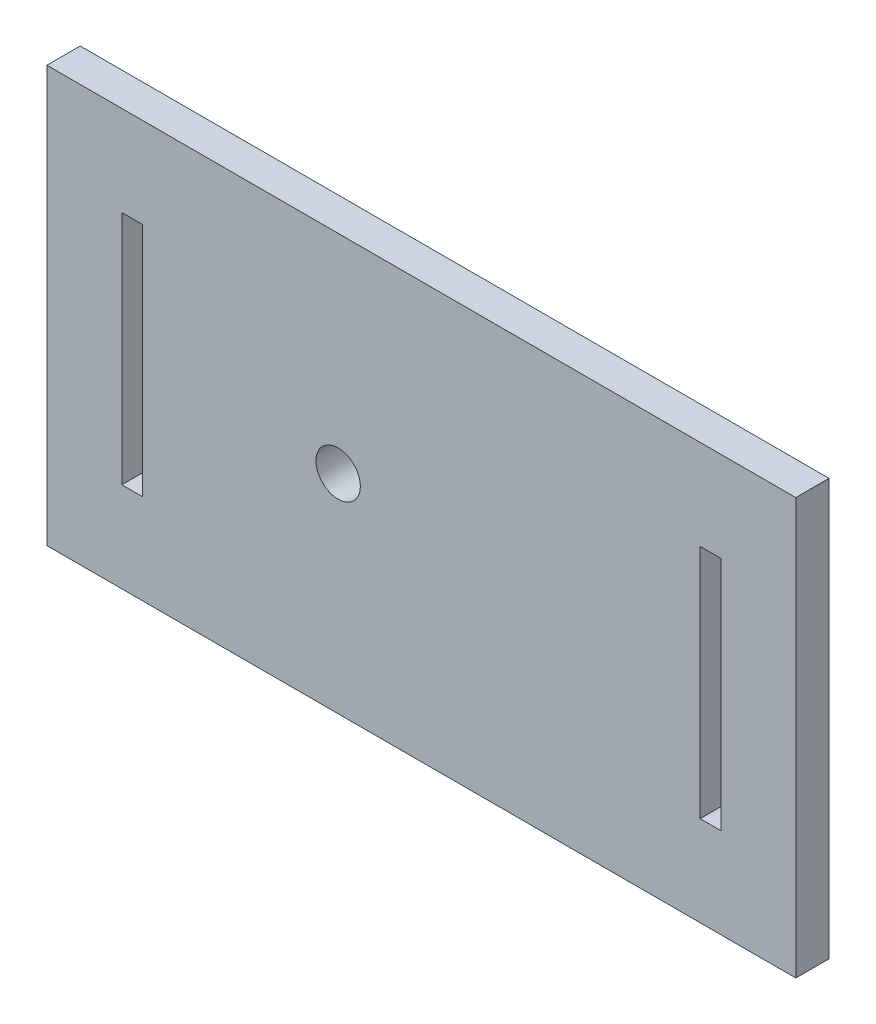
ISO-10303-21;
HEADER;
FILE_DESCRIPTION(('STEP AP214'),'2;1');
FILE_NAME('part.step','',(''),(''),'','','');
FILE_SCHEMA(('AUTOMOTIVE_DESIGN { 1 0 10303 214 1 1 1 1 }'));
ENDSEC;
DATA;
#1=APPLICATION_CONTEXT('core data for automotive mechanical design processes');
#2=APPLICATION_PROTOCOL_DEFINITION('international standard','automotive_design',2000,#1);
#3=PRODUCT_CONTEXT('',#1,'mechanical');
#4=PRODUCT('Part','Part','',(#3));
#5=PRODUCT_RELATED_PRODUCT_CATEGORY('part','',(#4));
#6=PRODUCT_DEFINITION_FORMATION('','',#4);
#7=PRODUCT_DEFINITION_CONTEXT('part definition',#1,'design');
#8=PRODUCT_DEFINITION('design','',#6,#7);
#9=PRODUCT_DEFINITION_SHAPE('','',#8);
#10=(LENGTH_UNIT() NAMED_UNIT(*) SI_UNIT(.MILLI.,.METRE.));
#11=(NAMED_UNIT(*) PLANE_ANGLE_UNIT() SI_UNIT($,.RADIAN.));
#12=(NAMED_UNIT(*) SI_UNIT($,.STERADIAN.) SOLID_ANGLE_UNIT());
#13=UNCERTAINTY_MEASURE_WITH_UNIT(LENGTH_MEASURE(1.E-05),#10,'distance_accuracy_value','');
#14=(GEOMETRIC_REPRESENTATION_CONTEXT(3) GLOBAL_UNCERTAINTY_ASSIGNED_CONTEXT((#13)) GLOBAL_UNIT_ASSIGNED_CONTEXT((#10,
#11,#12)) REPRESENTATION_CONTEXT('',''));
#15=CARTESIAN_POINT('',(0.,0.,0.));
#16=DIRECTION('',(0.,0.,1.));
#17=DIRECTION('',(1.,0.,0.));
#18=AXIS2_PLACEMENT_3D('',#15,#16,#17);
#19=CARTESIAN_POINT('',(27.,0.,2.4));
#20=DIRECTION('',(1.,0.,0.));
#21=DIRECTION('',(0.,1.,0.));
#22=AXIS2_PLACEMENT_3D('',#19,#20,#21);
#23=PLANE('',#22);
#24=DIRECTION('',(0.,-1.,0.));
#25=VECTOR('',#24,1.);
#26=CARTESIAN_POINT('',(27.,0.,0.));
#27=LINE('',#26,#25);
#28=CARTESIAN_POINT('',(27.,15.,0.));
#29=VERTEX_POINT('',#28);
#30=CARTESIAN_POINT('',(27.,-15.,0.));
#31=VERTEX_POINT('',#30);
#32=EDGE_CURVE('E208',#29,#31,#27,.T.);
#33=ORIENTED_EDGE('',*,*,#32,.F.);
#34=DIRECTION('',(0.,0.,-1.));
#35=VECTOR('',#34,1.);
#36=CARTESIAN_POINT('',(27.,15.,2.4));
#37=LINE('',#36,#35);
#38=CARTESIAN_POINT('',(27.,15.,2.4));
#39=VERTEX_POINT('',#38);
#40=EDGE_CURVE('E11',#39,#29,#37,.T.);
#41=ORIENTED_EDGE('',*,*,#40,.F.);
#42=DIRECTION('',(0.,-1.,0.));
#43=VECTOR('',#42,1.);
#44=CARTESIAN_POINT('',(27.,0.,2.4));
#45=LINE('',#44,#43);
#46=CARTESIAN_POINT('',(27.,-15.,2.4));
#47=VERTEX_POINT('',#46);
#48=EDGE_CURVE('E144',#39,#47,#45,.T.);
#49=ORIENTED_EDGE('',*,*,#48,.T.);
#50=DIRECTION('',(0.,0.,-1.));
#51=VECTOR('',#50,1.);
#52=CARTESIAN_POINT('',(27.,-15.,2.4));
#53=LINE('',#52,#51);
#54=EDGE_CURVE('E53',#47,#31,#53,.T.);
#55=ORIENTED_EDGE('',*,*,#54,.T.);
#56=EDGE_LOOP('',(#33,#41,#49,#55));
#57=FACE_BOUND('',#56,.T.);
#58=ADVANCED_FACE('F34',(#57),#23,.T.);
#59=CARTESIAN_POINT('',(0.,15.,2.4));
#60=DIRECTION('',(0.,-1.,0.));
#61=DIRECTION('',(1.,0.,0.));
#62=AXIS2_PLACEMENT_3D('',#59,#60,#61);
#63=PLANE('',#62);
#64=DIRECTION('',(-1.,0.,0.));
#65=VECTOR('',#64,1.);
#66=CARTESIAN_POINT('',(0.,15.,0.));
#67=LINE('',#66,#65);
#68=CARTESIAN_POINT('',(-27.,15.,0.));
#69=VERTEX_POINT('',#68);
#70=EDGE_CURVE('E149',#29,#69,#67,.T.);
#71=ORIENTED_EDGE('',*,*,#70,.T.);
#72=DIRECTION('',(0.,0.,-1.));
#73=VECTOR('',#72,1.);
#74=CARTESIAN_POINT('',(-27.,15.,2.4));
#75=LINE('',#74,#73);
#76=CARTESIAN_POINT('',(-27.,15.,2.4));
#77=VERTEX_POINT('',#76);
#78=EDGE_CURVE('E44',#77,#69,#75,.T.);
#79=ORIENTED_EDGE('',*,*,#78,.F.);
#80=DIRECTION('',(-1.,0.,0.));
#81=VECTOR('',#80,1.);
#82=CARTESIAN_POINT('',(0.,15.,2.4));
#83=LINE('',#82,#81);
#84=EDGE_CURVE('E138',#39,#77,#83,.T.);
#85=ORIENTED_EDGE('',*,*,#84,.F.);
#86=ORIENTED_EDGE('',*,*,#40,.T.);
#87=EDGE_LOOP('',(#71,#79,#85,#86));
#88=FACE_BOUND('',#87,.T.);
#89=ADVANCED_FACE('F147',(#88),#63,.F.);
#90=CARTESIAN_POINT('',(-27.,0.,2.4));
#91=DIRECTION('',(1.,0.,0.));
#92=DIRECTION('',(0.,1.,0.));
#93=AXIS2_PLACEMENT_3D('',#90,#91,#92);
#94=PLANE('',#93);
#95=DIRECTION('',(0.,-1.,0.));
#96=VECTOR('',#95,1.);
#97=CARTESIAN_POINT('',(-27.,0.,0.));
#98=LINE('',#97,#96);
#99=CARTESIAN_POINT('',(-27.,-15.,0.));
#100=VERTEX_POINT('',#99);
#101=EDGE_CURVE('E211',#69,#100,#98,.T.);
#102=ORIENTED_EDGE('',*,*,#101,.T.);
#103=DIRECTION('',(0.,0.,-1.));
#104=VECTOR('',#103,1.);
#105=CARTESIAN_POINT('',(-27.,-15.,2.4));
#106=LINE('',#105,#104);
#107=CARTESIAN_POINT('',(-27.,-15.,2.4));
#108=VERTEX_POINT('',#107);
#109=EDGE_CURVE('E91',#108,#100,#106,.T.);
#110=ORIENTED_EDGE('',*,*,#109,.F.);
#111=DIRECTION('',(0.,-1.,0.));
#112=VECTOR('',#111,1.);
#113=CARTESIAN_POINT('',(-27.,0.,2.4));
#114=LINE('',#113,#112);
#115=EDGE_CURVE('E130',#77,#108,#114,.T.);
#116=ORIENTED_EDGE('',*,*,#115,.F.);
#117=ORIENTED_EDGE('',*,*,#78,.T.);
#118=EDGE_LOOP('',(#102,#110,#116,#117));
#119=FACE_BOUND('',#118,.T.);
#120=ADVANCED_FACE('F132',(#119),#94,.F.);
#121=CARTESIAN_POINT('',(0.,8.50000000000002,2.4));
#122=DIRECTION('',(0.,-1.,0.));
#123=DIRECTION('',(1.,0.,0.));
#124=AXIS2_PLACEMENT_3D('',#121,#122,#123);
#125=PLANE('',#124);
#126=DIRECTION('',(-1.,0.,0.));
#127=VECTOR('',#126,1.);
#128=CARTESIAN_POINT('',(0.,8.50000000000002,0.));
#129=LINE('',#128,#127);
#130=CARTESIAN_POINT('',(-20.1,8.5,0.));
#131=VERTEX_POINT('',#130);
#132=CARTESIAN_POINT('',(-21.6,8.5,0.));
#133=VERTEX_POINT('',#132);
#134=EDGE_CURVE('E196',#131,#133,#129,.T.);
#135=ORIENTED_EDGE('',*,*,#134,.F.);
#136=DIRECTION('',(0.,0.,-1.));
#137=VECTOR('',#136,1.);
#138=CARTESIAN_POINT('',(-20.1,8.5,2.4));
#139=LINE('',#138,#137);
#140=CARTESIAN_POINT('',(-20.1,8.5,2.4));
#141=VERTEX_POINT('',#140);
#142=EDGE_CURVE('E161',#141,#131,#139,.T.);
#143=ORIENTED_EDGE('',*,*,#142,.F.);
#144=DIRECTION('',(-1.,0.,0.));
#145=VECTOR('',#144,1.);
#146=CARTESIAN_POINT('',(0.,8.50000000000002,2.4));
#147=LINE('',#146,#145);
#148=CARTESIAN_POINT('',(-21.6,8.5,2.4));
#149=VERTEX_POINT('',#148);
#150=EDGE_CURVE('E230',#141,#149,#147,.T.);
#151=ORIENTED_EDGE('',*,*,#150,.T.);
#152=DIRECTION('',(0.,0.,-1.));
#153=VECTOR('',#152,1.);
#154=CARTESIAN_POINT('',(-21.6,8.5,2.4));
#155=LINE('',#154,#153);
#156=EDGE_CURVE('E154',#149,#133,#155,.T.);
#157=ORIENTED_EDGE('',*,*,#156,.T.);
#158=EDGE_LOOP('',(#135,#143,#151,#157));
#159=FACE_BOUND('',#158,.T.);
#160=ADVANCED_FACE('F277',(#159),#125,.T.);
#161=CARTESIAN_POINT('',(-20.1,0.,2.4));
#162=DIRECTION('',(1.,0.,0.));
#163=DIRECTION('',(0.,0.,-1.));
#164=AXIS2_PLACEMENT_3D('',#161,#162,#163);
#165=PLANE('',#164);
#166=DIRECTION('',(0.,-1.,0.));
#167=VECTOR('',#166,1.);
#168=CARTESIAN_POINT('',(-20.1,0.,0.));
#169=LINE('',#168,#167);
#170=CARTESIAN_POINT('',(-20.1,-8.5,0.));
#171=VERTEX_POINT('',#170);
#172=EDGE_CURVE('E199',#131,#171,#169,.T.);
#173=ORIENTED_EDGE('',*,*,#172,.T.);
#174=DIRECTION('',(0.,0.,-1.));
#175=VECTOR('',#174,1.);
#176=CARTESIAN_POINT('',(-20.1,-8.5,2.4));
#177=LINE('',#176,#175);
#178=CARTESIAN_POINT('',(-20.1,-8.5,2.4));
#179=VERTEX_POINT('',#178);
#180=EDGE_CURVE('E158',#179,#171,#177,.T.);
#181=ORIENTED_EDGE('',*,*,#180,.F.);
#182=DIRECTION('',(0.,-1.,0.));
#183=VECTOR('',#182,1.);
#184=CARTESIAN_POINT('',(-20.1,0.,2.4));
#185=LINE('',#184,#183);
#186=EDGE_CURVE('E233',#141,#179,#185,.T.);
#187=ORIENTED_EDGE('',*,*,#186,.F.);
#188=ORIENTED_EDGE('',*,*,#142,.T.);
#189=EDGE_LOOP('',(#173,#181,#187,#188));
#190=FACE_BOUND('',#189,.T.);
#191=ADVANCED_FACE('F273',(#190),#165,.F.);
#192=CARTESIAN_POINT('',(0.,-8.5,2.4));
#193=DIRECTION('',(0.,-1.,0.));
#194=DIRECTION('',(1.,0.,0.));
#195=AXIS2_PLACEMENT_3D('',#192,#193,#194);
#196=PLANE('',#195);
#197=DIRECTION('',(-1.,0.,0.));
#198=VECTOR('',#197,1.);
#199=CARTESIAN_POINT('',(0.,-8.5,0.));
#200=LINE('',#199,#198);
#201=CARTESIAN_POINT('',(-21.6,-8.5,0.));
#202=VERTEX_POINT('',#201);
#203=EDGE_CURVE('E202',#171,#202,#200,.T.);
#204=ORIENTED_EDGE('',*,*,#203,.T.);
#205=DIRECTION('',(0.,0.,-1.));
#206=VECTOR('',#205,1.);
#207=CARTESIAN_POINT('',(-21.6,-8.5,2.4));
#208=LINE('',#207,#206);
#209=CARTESIAN_POINT('',(-21.6,-8.5,2.4));
#210=VERTEX_POINT('',#209);
#211=EDGE_CURVE('E156',#210,#202,#208,.T.);
#212=ORIENTED_EDGE('',*,*,#211,.F.);
#213=DIRECTION('',(-1.,0.,0.));
#214=VECTOR('',#213,1.);
#215=CARTESIAN_POINT('',(0.,-8.5,2.4));
#216=LINE('',#215,#214);
#217=EDGE_CURVE('E236',#179,#210,#216,.T.);
#218=ORIENTED_EDGE('',*,*,#217,.F.);
#219=ORIENTED_EDGE('',*,*,#180,.T.);
#220=EDGE_LOOP('',(#204,#212,#218,#219));
#221=FACE_BOUND('',#220,.T.);
#222=ADVANCED_FACE('F270',(#221),#196,.F.);
#223=CARTESIAN_POINT('',(20.1,0.,2.4));
#224=DIRECTION('',(1.,0.,0.));
#225=DIRECTION('',(0.,1.,0.));
#226=AXIS2_PLACEMENT_3D('',#223,#224,#225);
#227=PLANE('',#226);
#228=DIRECTION('',(0.,-1.,0.));
#229=VECTOR('',#228,1.);
#230=CARTESIAN_POINT('',(20.1,0.,0.));
#231=LINE('',#230,#229);
#232=CARTESIAN_POINT('',(20.1,8.50000000000001,0.));
#233=VERTEX_POINT('',#232);
#234=CARTESIAN_POINT('',(20.1,-8.49999999999999,0.));
#235=VERTEX_POINT('',#234);
#236=EDGE_CURVE('E185',#233,#235,#231,.T.);
#237=ORIENTED_EDGE('',*,*,#236,.F.);
#238=DIRECTION('',(0.,0.,-1.));
#239=VECTOR('',#238,1.);
#240=CARTESIAN_POINT('',(20.1,8.50000000000001,2.4));
#241=LINE('',#240,#239);
#242=CARTESIAN_POINT('',(20.1,8.50000000000001,2.4));
#243=VERTEX_POINT('',#242);
#244=EDGE_CURVE('E38',#243,#233,#241,.T.);
#245=ORIENTED_EDGE('',*,*,#244,.F.);
#246=DIRECTION('',(0.,-1.,0.));
#247=VECTOR('',#246,1.);
#248=CARTESIAN_POINT('',(20.1,0.,2.4));
#249=LINE('',#248,#247);
#250=CARTESIAN_POINT('',(20.1,-8.49999999999999,2.4));
#251=VERTEX_POINT('',#250);
#252=EDGE_CURVE('E218',#243,#251,#249,.T.);
#253=ORIENTED_EDGE('',*,*,#252,.T.);
#254=DIRECTION('',(0.,0.,-1.));
#255=VECTOR('',#254,1.);
#256=CARTESIAN_POINT('',(20.1,-8.49999999999999,2.4));
#257=LINE('',#256,#255);
#258=EDGE_CURVE('E163',#251,#235,#257,.T.);
#259=ORIENTED_EDGE('',*,*,#258,.T.);
#260=EDGE_LOOP('',(#237,#245,#253,#259));
#261=FACE_BOUND('',#260,.T.);
#262=ADVANCED_FACE('F36',(#261),#227,.T.);
#263=CARTESIAN_POINT('',(0.,8.50000000000003,2.4));
#264=DIRECTION('',(0.,1.,0.));
#265=DIRECTION('',(-1.,0.,0.));
#266=AXIS2_PLACEMENT_3D('',#263,#264,#265);
#267=PLANE('',#266);
#268=DIRECTION('',(1.,0.,0.));
#269=VECTOR('',#268,1.);
#270=CARTESIAN_POINT('',(0.,8.50000000000003,0.));
#271=LINE('',#270,#269);
#272=CARTESIAN_POINT('',(21.6,8.5,0.));
#273=VERTEX_POINT('',#272);
#274=EDGE_CURVE('E177',#233,#273,#271,.T.);
#275=ORIENTED_EDGE('',*,*,#274,.T.);
#276=DIRECTION('',(0.,0.,-1.));
#277=VECTOR('',#276,1.);
#278=CARTESIAN_POINT('',(21.6,8.5,2.4));
#279=LINE('',#278,#277);
#280=CARTESIAN_POINT('',(21.6,8.5,2.4));
#281=VERTEX_POINT('',#280);
#282=EDGE_CURVE('E167',#281,#273,#279,.T.);
#283=ORIENTED_EDGE('',*,*,#282,.F.);
#284=DIRECTION('',(1.,0.,0.));
#285=VECTOR('',#284,1.);
#286=CARTESIAN_POINT('',(0.,8.50000000000003,2.4));
#287=LINE('',#286,#285);
#288=EDGE_CURVE('E178',#243,#281,#287,.T.);
#289=ORIENTED_EDGE('',*,*,#288,.F.);
#290=ORIENTED_EDGE('',*,*,#244,.T.);
#291=EDGE_LOOP('',(#275,#283,#289,#290));
#292=FACE_BOUND('',#291,.T.);
#293=ADVANCED_FACE('F176',(#292),#267,.F.);
#294=CARTESIAN_POINT('',(21.6,0.,2.4));
#295=DIRECTION('',(1.,0.,0.));
#296=DIRECTION('',(0.,1.,0.));
#297=AXIS2_PLACEMENT_3D('',#294,#295,#296);
#298=PLANE('',#297);
#299=DIRECTION('',(0.,-1.,0.));
#300=VECTOR('',#299,1.);
#301=CARTESIAN_POINT('',(21.6,0.,0.));
#302=LINE('',#301,#300);
#303=CARTESIAN_POINT('',(21.6,-8.5,0.));
#304=VERTEX_POINT('',#303);
#305=EDGE_CURVE('E187',#273,#304,#302,.T.);
#306=ORIENTED_EDGE('',*,*,#305,.T.);
#307=DIRECTION('',(0.,0.,-1.));
#308=VECTOR('',#307,1.);
#309=CARTESIAN_POINT('',(21.6,-8.5,2.4));
#310=LINE('',#309,#308);
#311=CARTESIAN_POINT('',(21.6,-8.5,2.4));
#312=VERTEX_POINT('',#311);
#313=EDGE_CURVE('E165',#312,#304,#310,.T.);
#314=ORIENTED_EDGE('',*,*,#313,.F.);
#315=DIRECTION('',(0.,-1.,0.));
#316=VECTOR('',#315,1.);
#317=CARTESIAN_POINT('',(21.6,0.,2.4));
#318=LINE('',#317,#316);
#319=EDGE_CURVE('E223',#281,#312,#318,.T.);
#320=ORIENTED_EDGE('',*,*,#319,.F.);
#321=ORIENTED_EDGE('',*,*,#282,.T.);
#322=EDGE_LOOP('',(#306,#314,#320,#321));
#323=FACE_BOUND('',#322,.T.);
#324=ADVANCED_FACE('F285',(#323),#298,.F.);
#325=CARTESIAN_POINT('',(0.,-15.,2.4));
#326=DIRECTION('',(0.,-1.,0.));
#327=DIRECTION('',(1.,0.,0.));
#328=AXIS2_PLACEMENT_3D('',#325,#326,#327);
#329=PLANE('',#328);
#330=DIRECTION('',(-1.,0.,0.));
#331=VECTOR('',#330,1.);
#332=CARTESIAN_POINT('',(0.,-15.,0.));
#333=LINE('',#332,#331);
#334=EDGE_CURVE('E213',#31,#100,#333,.T.);
#335=ORIENTED_EDGE('',*,*,#334,.F.);
#336=ORIENTED_EDGE('',*,*,#54,.F.);
#337=DIRECTION('',(-1.,0.,0.));
#338=VECTOR('',#337,1.);
#339=CARTESIAN_POINT('',(0.,-15.,2.4));
#340=LINE('',#339,#338);
#341=EDGE_CURVE('E137',#47,#108,#340,.T.);
#342=ORIENTED_EDGE('',*,*,#341,.T.);
#343=ORIENTED_EDGE('',*,*,#109,.T.);
#344=EDGE_LOOP('',(#335,#336,#342,#343));
#345=FACE_BOUND('',#344,.T.);
#346=ADVANCED_FACE('F268',(#345),#329,.T.);
#347=CARTESIAN_POINT('',(-21.6,0.,2.4));
#348=DIRECTION('',(1.,0.,0.));
#349=DIRECTION('',(0.,1.,0.));
#350=AXIS2_PLACEMENT_3D('',#347,#348,#349);
#351=PLANE('',#350);
#352=DIRECTION('',(0.,-1.,0.));
#353=VECTOR('',#352,1.);
#354=CARTESIAN_POINT('',(-21.6,0.,0.));
#355=LINE('',#354,#353);
#356=EDGE_CURVE('E205',#133,#202,#355,.T.);
#357=ORIENTED_EDGE('',*,*,#356,.F.);
#358=ORIENTED_EDGE('',*,*,#156,.F.);
#359=DIRECTION('',(0.,-1.,0.));
#360=VECTOR('',#359,1.);
#361=CARTESIAN_POINT('',(-21.6,0.,2.4));
#362=LINE('',#361,#360);
#363=EDGE_CURVE('E238',#149,#210,#362,.T.);
#364=ORIENTED_EDGE('',*,*,#363,.T.);
#365=ORIENTED_EDGE('',*,*,#211,.T.);
#366=EDGE_LOOP('',(#357,#358,#364,#365));
#367=FACE_BOUND('',#366,.T.);
#368=ADVANCED_FACE('F265',(#367),#351,.T.);
#369=CARTESIAN_POINT('',(0.,-8.49999999999997,2.4));
#370=DIRECTION('',(0.,1.,0.));
#371=DIRECTION('',(-1.,0.,0.));
#372=AXIS2_PLACEMENT_3D('',#369,#370,#371);
#373=PLANE('',#372);
#374=DIRECTION('',(1.,0.,0.));
#375=VECTOR('',#374,1.);
#376=CARTESIAN_POINT('',(0.,-8.49999999999997,0.));
#377=LINE('',#376,#375);
#378=EDGE_CURVE('E194',#235,#304,#377,.T.);
#379=ORIENTED_EDGE('',*,*,#378,.F.);
#380=ORIENTED_EDGE('',*,*,#258,.F.);
#381=DIRECTION('',(1.,0.,0.));
#382=VECTOR('',#381,1.);
#383=CARTESIAN_POINT('',(0.,-8.49999999999997,2.4));
#384=LINE('',#383,#382);
#385=EDGE_CURVE('E227',#251,#312,#384,.T.);
#386=ORIENTED_EDGE('',*,*,#385,.T.);
#387=ORIENTED_EDGE('',*,*,#313,.T.);
#388=EDGE_LOOP('',(#379,#380,#386,#387));
#389=FACE_BOUND('',#388,.T.);
#390=ADVANCED_FACE('F254',(#389),#373,.T.);
#391=CARTESIAN_POINT('',(-6.,0.,2.4));
#392=DIRECTION('',(0.,0.,-1.));
#393=DIRECTION('',(-1.,0.,0.));
#394=AXIS2_PLACEMENT_3D('',#391,#392,#393);
#395=CYLINDRICAL_SURFACE('',#394,1.6);
#396=CARTESIAN_POINT('',(-6.,0.,2.4));
#397=DIRECTION('',(0.,0.,1.));
#398=DIRECTION('',(1.,0.,0.));
#399=AXIS2_PLACEMENT_3D('',#396,#397,#398);
#400=CIRCLE('',#399,1.6);
#401=CARTESIAN_POINT('',(-4.4,0.,2.4));
#402=VERTEX_POINT('',#401);
#403=EDGE_CURVE('E166',#402,#402,#400,.T.);
#404=ORIENTED_EDGE('',*,*,#403,.T.);
#405=EDGE_LOOP('',(#404));
#406=FACE_BOUND('',#405,.T.);
#407=CARTESIAN_POINT('',(-6.,0.,0.));
#408=DIRECTION('',(0.,0.,1.));
#409=DIRECTION('',(1.,0.,0.));
#410=AXIS2_PLACEMENT_3D('',#407,#408,#409);
#411=CIRCLE('',#410,1.6);
#412=CARTESIAN_POINT('',(-4.4,0.,0.));
#413=VERTEX_POINT('',#412);
#414=EDGE_CURVE('E216',#413,#413,#411,.T.);
#415=ORIENTED_EDGE('',*,*,#414,.F.);
#416=EDGE_LOOP('',(#415));
#417=FACE_BOUND('',#416,.T.);
#418=ADVANCED_FACE('F244',(#406,#417),#395,.F.);
#419=CARTESIAN_POINT('',(0.,0.,2.4));
#420=DIRECTION('',(0.,0.,1.));
#421=DIRECTION('',(1.,0.,0.));
#422=AXIS2_PLACEMENT_3D('',#419,#420,#421);
#423=PLANE('',#422);
#424=ORIENTED_EDGE('',*,*,#252,.F.);
#425=ORIENTED_EDGE('',*,*,#288,.T.);
#426=ORIENTED_EDGE('',*,*,#319,.T.);
#427=ORIENTED_EDGE('',*,*,#385,.F.);
#428=EDGE_LOOP('',(#424,#425,#426,#427));
#429=FACE_BOUND('',#428,.T.);
#430=ORIENTED_EDGE('',*,*,#150,.F.);
#431=ORIENTED_EDGE('',*,*,#186,.T.);
#432=ORIENTED_EDGE('',*,*,#217,.T.);
#433=ORIENTED_EDGE('',*,*,#363,.F.);
#434=EDGE_LOOP('',(#430,#431,#432,#433));
#435=FACE_BOUND('',#434,.T.);
#436=ORIENTED_EDGE('',*,*,#48,.F.);
#437=ORIENTED_EDGE('',*,*,#84,.T.);
#438=ORIENTED_EDGE('',*,*,#115,.T.);
#439=ORIENTED_EDGE('',*,*,#341,.F.);
#440=EDGE_LOOP('',(#436,#437,#438,#439));
#441=FACE_BOUND('',#440,.T.);
#442=ORIENTED_EDGE('',*,*,#403,.F.);
#443=EDGE_LOOP('',(#442));
#444=FACE_BOUND('',#443,.T.);
#445=ADVANCED_FACE('F142',(#429,#435,#441,#444),#423,.T.);
#446=CARTESIAN_POINT('',(0.,0.,0.));
#447=DIRECTION('',(0.,0.,1.));
#448=DIRECTION('',(1.,0.,0.));
#449=AXIS2_PLACEMENT_3D('',#446,#447,#448);
#450=PLANE('',#449);
#451=ORIENTED_EDGE('',*,*,#236,.T.);
#452=ORIENTED_EDGE('',*,*,#378,.T.);
#453=ORIENTED_EDGE('',*,*,#305,.F.);
#454=ORIENTED_EDGE('',*,*,#274,.F.);
#455=EDGE_LOOP('',(#451,#452,#453,#454));
#456=FACE_BOUND('',#455,.T.);
#457=ORIENTED_EDGE('',*,*,#134,.T.);
#458=ORIENTED_EDGE('',*,*,#356,.T.);
#459=ORIENTED_EDGE('',*,*,#203,.F.);
#460=ORIENTED_EDGE('',*,*,#172,.F.);
#461=EDGE_LOOP('',(#457,#458,#459,#460));
#462=FACE_BOUND('',#461,.T.);
#463=ORIENTED_EDGE('',*,*,#32,.T.);
#464=ORIENTED_EDGE('',*,*,#334,.T.);
#465=ORIENTED_EDGE('',*,*,#101,.F.);
#466=ORIENTED_EDGE('',*,*,#70,.F.);
#467=EDGE_LOOP('',(#463,#464,#465,#466));
#468=FACE_BOUND('',#467,.T.);
#469=ORIENTED_EDGE('',*,*,#414,.T.);
#470=EDGE_LOOP('',(#469));
#471=FACE_BOUND('',#470,.T.);
#472=ADVANCED_FACE('F182',(#456,#462,#468,#471),#450,.F.);
#473=CLOSED_SHELL('',(#58,#89,#120,#160,#191,#222,#262,#293,#324,#346,#368,#390,#418,#445,#472));
#474=MANIFOLD_SOLID_BREP('B2',#473);
#475=ADVANCED_BREP_SHAPE_REPRESENTATION('',(#18,#474),#14);
#476=SHAPE_DEFINITION_REPRESENTATION(#9,#475);
ENDSEC;
END-ISO-10303-21;
